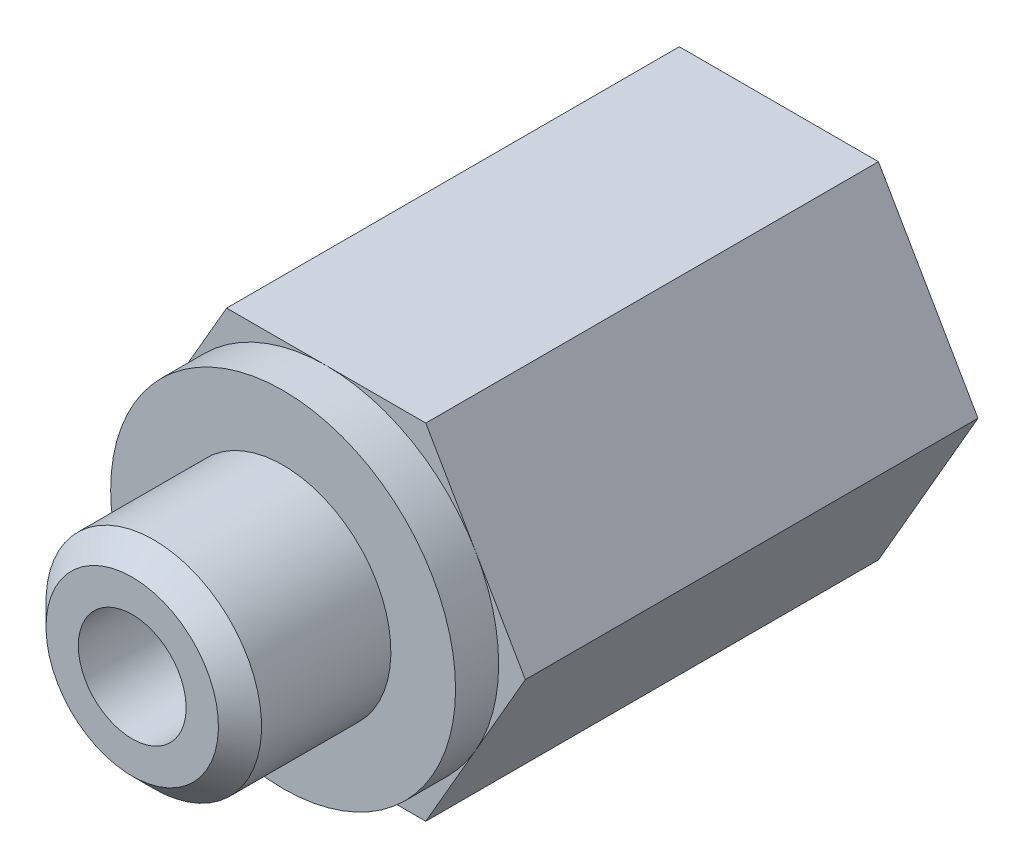
ISO-10303-21;
HEADER;
FILE_DESCRIPTION(('STEP AP214'),'2;1');
FILE_NAME('part.step','',(''),(''),'','','');
FILE_SCHEMA(('AUTOMOTIVE_DESIGN { 1 0 10303 214 1 1 1 1 }'));
ENDSEC;
DATA;
#1=APPLICATION_CONTEXT('core data for automotive mechanical design processes');
#2=APPLICATION_PROTOCOL_DEFINITION('international standard','automotive_design',2000,#1);
#3=PRODUCT_CONTEXT('',#1,'mechanical');
#4=PRODUCT('Part','Part','',(#3));
#5=PRODUCT_RELATED_PRODUCT_CATEGORY('part','',(#4));
#6=PRODUCT_DEFINITION_FORMATION('','',#4);
#7=PRODUCT_DEFINITION_CONTEXT('part definition',#1,'design');
#8=PRODUCT_DEFINITION('design','',#6,#7);
#9=PRODUCT_DEFINITION_SHAPE('','',#8);
#10=(LENGTH_UNIT() NAMED_UNIT(*) SI_UNIT(.MILLI.,.METRE.));
#11=(NAMED_UNIT(*) PLANE_ANGLE_UNIT() SI_UNIT($,.RADIAN.));
#12=(NAMED_UNIT(*) SI_UNIT($,.STERADIAN.) SOLID_ANGLE_UNIT());
#13=UNCERTAINTY_MEASURE_WITH_UNIT(LENGTH_MEASURE(1.E-05),#10,'distance_accuracy_value','');
#14=(GEOMETRIC_REPRESENTATION_CONTEXT(3) GLOBAL_UNCERTAINTY_ASSIGNED_CONTEXT((#13)) GLOBAL_UNIT_ASSIGNED_CONTEXT((#10,
#11,#12)) REPRESENTATION_CONTEXT('',''));
#15=CARTESIAN_POINT('',(0.,0.,0.));
#16=DIRECTION('',(0.,0.,1.));
#17=DIRECTION('',(1.,0.,0.));
#18=AXIS2_PLACEMENT_3D('',#15,#16,#17);
#19=CARTESIAN_POINT('',(0.,4.,6.25));
#20=DIRECTION('',(0.,0.,-1.));
#21=DIRECTION('',(0.,1.,0.));
#22=AXIS2_PLACEMENT_3D('',#19,#20,#21);
#23=PLANE('',#22);
#24=CARTESIAN_POINT('',(0.,0.,6.25));
#25=DIRECTION('',(0.,0.,1.));
#26=DIRECTION('',(0.,-1.,0.));
#27=AXIS2_PLACEMENT_3D('',#24,#25,#26);
#28=CIRCLE('',#27,4.);
#29=CARTESIAN_POINT('',(0.,-4.,6.25));
#30=VERTEX_POINT('',#29);
#31=EDGE_CURVE('E142',#30,#30,#28,.F.);
#32=ORIENTED_EDGE('',*,*,#31,.F.);
#33=EDGE_LOOP('',(#32));
#34=FACE_BOUND('',#33,.T.);
#35=CARTESIAN_POINT('',(0.,0.,6.25));
#36=DIRECTION('',(0.,0.,1.));
#37=DIRECTION('',(0.,-1.,0.));
#38=AXIS2_PLACEMENT_3D('',#35,#36,#37);
#39=CIRCLE('',#38,2.5);
#40=CARTESIAN_POINT('',(0.,-2.5,6.25));
#41=VERTEX_POINT('',#40);
#42=EDGE_CURVE('E19',#41,#41,#39,.T.);
#43=ORIENTED_EDGE('',*,*,#42,.F.);
#44=EDGE_LOOP('',(#43));
#45=FACE_BOUND('',#44,.T.);
#46=ADVANCED_FACE('F16',(#34,#45),#23,.F.);
#47=CARTESIAN_POINT('',(0.,0.,9.75));
#48=DIRECTION('',(0.,0.,1.));
#49=DIRECTION('',(0.,-1.,0.));
#50=AXIS2_PLACEMENT_3D('',#47,#48,#49);
#51=CYLINDRICAL_SURFACE('',#50,2.5);
#52=ORIENTED_EDGE('',*,*,#42,.T.);
#53=EDGE_LOOP('',(#52));
#54=FACE_BOUND('',#53,.T.);
#55=CARTESIAN_POINT('',(0.,0.,9.25000000000864));
#56=DIRECTION('',(0.,0.,-1.));
#57=DIRECTION('',(0.,1.,0.));
#58=AXIS2_PLACEMENT_3D('',#55,#56,#57);
#59=CIRCLE('',#58,2.49999999999773);
#60=CARTESIAN_POINT('',(0.,2.49999999999773,9.25000000000864));
#61=VERTEX_POINT('',#60);
#62=EDGE_CURVE('E105',#61,#61,#59,.F.);
#63=ORIENTED_EDGE('',*,*,#62,.F.);
#64=EDGE_LOOP('',(#63));
#65=FACE_BOUND('',#64,.T.);
#66=ADVANCED_FACE('F163',(#54,#65),#51,.T.);
#67=CARTESIAN_POINT('',(0.,0.,9.75));
#68=DIRECTION('',(0.,0.,1.));
#69=DIRECTION('',(0.,-1.,0.));
#70=AXIS2_PLACEMENT_3D('',#67,#68,#69);
#71=CYLINDRICAL_SURFACE('',#70,4.);
#72=ORIENTED_EDGE('',*,*,#31,.T.);
#73=EDGE_LOOP('',(#72));
#74=FACE_BOUND('',#73,.T.);
#75=CARTESIAN_POINT('',(0.,0.,5.25));
#76=DIRECTION('',(0.,0.,1.));
#77=DIRECTION('',(0.,-1.,0.));
#78=AXIS2_PLACEMENT_3D('',#75,#76,#77);
#79=CIRCLE('',#78,4.);
#80=CARTESIAN_POINT('',(3.46410161513776,-2.,5.25));
#81=VERTEX_POINT('',#80);
#82=CARTESIAN_POINT('',(0.,-4.,5.25));
#83=VERTEX_POINT('',#82);
#84=EDGE_CURVE('E101',#81,#83,#79,.F.);
#85=ORIENTED_EDGE('',*,*,#84,.F.);
#86=CARTESIAN_POINT('',(0.,0.,5.25));
#87=DIRECTION('',(0.,0.,1.));
#88=DIRECTION('',(0.,-1.,0.));
#89=AXIS2_PLACEMENT_3D('',#86,#87,#88);
#90=CIRCLE('',#89,4.);
#91=CARTESIAN_POINT('',(3.46410161513775,2.,5.25));
#92=VERTEX_POINT('',#91);
#93=EDGE_CURVE('E95',#92,#81,#90,.F.);
#94=ORIENTED_EDGE('',*,*,#93,.F.);
#95=CARTESIAN_POINT('',(0.,0.,5.25));
#96=DIRECTION('',(0.,0.,1.));
#97=DIRECTION('',(0.,-1.,0.));
#98=AXIS2_PLACEMENT_3D('',#95,#96,#97);
#99=CIRCLE('',#98,4.);
#100=CARTESIAN_POINT('',(0.,4.,5.25));
#101=VERTEX_POINT('',#100);
#102=EDGE_CURVE('E84',#101,#92,#99,.F.);
#103=ORIENTED_EDGE('',*,*,#102,.F.);
#104=CARTESIAN_POINT('',(0.,0.,5.25));
#105=DIRECTION('',(0.,0.,1.));
#106=DIRECTION('',(0.,-1.,0.));
#107=AXIS2_PLACEMENT_3D('',#104,#105,#106);
#108=CIRCLE('',#107,4.);
#109=CARTESIAN_POINT('',(-3.46410161513775,2.,5.25));
#110=VERTEX_POINT('',#109);
#111=EDGE_CURVE('E94',#110,#101,#108,.F.);
#112=ORIENTED_EDGE('',*,*,#111,.F.);
#113=CARTESIAN_POINT('',(0.,0.,5.25));
#114=DIRECTION('',(0.,0.,1.));
#115=DIRECTION('',(0.,-1.,0.));
#116=AXIS2_PLACEMENT_3D('',#113,#114,#115);
#117=CIRCLE('',#116,4.);
#118=CARTESIAN_POINT('',(-3.46410161513775,-2.,5.25));
#119=VERTEX_POINT('',#118);
#120=EDGE_CURVE('E155',#119,#110,#117,.F.);
#121=ORIENTED_EDGE('',*,*,#120,.F.);
#122=CARTESIAN_POINT('',(0.,0.,5.25));
#123=DIRECTION('',(0.,0.,1.));
#124=DIRECTION('',(0.,-1.,0.));
#125=AXIS2_PLACEMENT_3D('',#122,#123,#124);
#126=CIRCLE('',#125,4.);
#127=EDGE_CURVE('E153',#83,#119,#126,.F.);
#128=ORIENTED_EDGE('',*,*,#127,.F.);
#129=EDGE_LOOP('',(#85,#94,#103,#112,#121,#128));
#130=FACE_BOUND('',#129,.T.);
#131=ADVANCED_FACE('F99',(#74,#130),#71,.T.);
#132=CARTESIAN_POINT('',(0.,0.,9.25000000006548));
#133=DIRECTION('',(0.,0.,-1.));
#134=DIRECTION('',(0.,1.,0.));
#135=AXIS2_PLACEMENT_3D('',#132,#133,#134);
#136=CONICAL_SURFACE('',#135,2.49999999988404,0.785398163397448);
#137=CARTESIAN_POINT('',(0.,0.,9.74999999999682));
#138=DIRECTION('',(0.,0.,-1.));
#139=DIRECTION('',(0.,1.,0.));
#140=AXIS2_PLACEMENT_3D('',#137,#138,#139);
#141=CIRCLE('',#140,1.99999999995271);
#142=CARTESIAN_POINT('',(0.,1.99999999995271,9.74999999999682));
#143=VERTEX_POINT('',#142);
#144=EDGE_CURVE('E149',#143,#143,#141,.T.);
#145=ORIENTED_EDGE('',*,*,#144,.T.);
#146=EDGE_LOOP('',(#145));
#147=FACE_BOUND('',#146,.T.);
#148=ORIENTED_EDGE('',*,*,#62,.T.);
#149=EDGE_LOOP('',(#148));
#150=FACE_BOUND('',#149,.T.);
#151=ADVANCED_FACE('F238',(#147,#150),#136,.T.);
#152=CARTESIAN_POINT('',(2.30940107675851,-4.,5.25));
#153=DIRECTION('',(0.,0.,1.));
#154=DIRECTION('',(1.,0.,0.));
#155=AXIS2_PLACEMENT_3D('',#152,#153,#154);
#156=PLANE('',#155);
#157=DIRECTION('',(-0.499999999999999,-0.866025403784439,0.));
#158=VECTOR('',#157,1.);
#159=CARTESIAN_POINT('',(2.3094010767585,-4.,5.25));
#160=LINE('',#159,#158);
#161=CARTESIAN_POINT('',(4.618802153517,0.,5.25));
#162=VERTEX_POINT('',#161);
#163=EDGE_CURVE('E117',#81,#162,#160,.F.);
#164=ORIENTED_EDGE('',*,*,#163,.T.);
#165=DIRECTION('',(0.5,-0.866025403784439,0.));
#166=VECTOR('',#165,1.);
#167=CARTESIAN_POINT('',(4.618802153517,0.,5.25));
#168=LINE('',#167,#166);
#169=EDGE_CURVE('E111',#162,#92,#168,.F.);
#170=ORIENTED_EDGE('',*,*,#169,.T.);
#171=ORIENTED_EDGE('',*,*,#93,.T.);
#172=EDGE_LOOP('',(#164,#170,#171));
#173=FACE_BOUND('',#172,.T.);
#174=ADVANCED_FACE('F116',(#173),#156,.T.);
#175=CARTESIAN_POINT('',(2.30940107675851,-4.,5.25));
#176=DIRECTION('',(0.,0.,1.));
#177=DIRECTION('',(1.,0.,0.));
#178=AXIS2_PLACEMENT_3D('',#175,#176,#177);
#179=PLANE('',#178);
#180=DIRECTION('',(0.5,-0.866025403784439,0.));
#181=VECTOR('',#180,1.);
#182=CARTESIAN_POINT('',(4.618802153517,0.,5.25));
#183=LINE('',#182,#181);
#184=CARTESIAN_POINT('',(2.3094010767585,4.,5.25));
#185=VERTEX_POINT('',#184);
#186=EDGE_CURVE('E88',#92,#185,#183,.F.);
#187=ORIENTED_EDGE('',*,*,#186,.T.);
#188=DIRECTION('',(1.,0.,0.));
#189=VECTOR('',#188,1.);
#190=CARTESIAN_POINT('',(2.3094010767585,4.,5.25));
#191=LINE('',#190,#189);
#192=EDGE_CURVE('E90',#185,#101,#191,.F.);
#193=ORIENTED_EDGE('',*,*,#192,.T.);
#194=ORIENTED_EDGE('',*,*,#102,.T.);
#195=EDGE_LOOP('',(#187,#193,#194));
#196=FACE_BOUND('',#195,.T.);
#197=ADVANCED_FACE('F86',(#196),#179,.T.);
#198=CARTESIAN_POINT('',(2.30940107675851,-4.,5.25));
#199=DIRECTION('',(0.,0.,1.));
#200=DIRECTION('',(1.,0.,0.));
#201=AXIS2_PLACEMENT_3D('',#198,#199,#200);
#202=PLANE('',#201);
#203=DIRECTION('',(1.,0.,0.));
#204=VECTOR('',#203,1.);
#205=CARTESIAN_POINT('',(2.3094010767585,4.,5.25));
#206=LINE('',#205,#204);
#207=CARTESIAN_POINT('',(-2.30940107675849,4.,5.25));
#208=VERTEX_POINT('',#207);
#209=EDGE_CURVE('E414',#101,#208,#206,.F.);
#210=ORIENTED_EDGE('',*,*,#209,.T.);
#211=DIRECTION('',(0.5,0.866025403784439,0.));
#212=VECTOR('',#211,1.);
#213=CARTESIAN_POINT('',(-2.30940107675849,4.,5.25));
#214=LINE('',#213,#212);
#215=EDGE_CURVE('E416',#208,#110,#214,.F.);
#216=ORIENTED_EDGE('',*,*,#215,.T.);
#217=ORIENTED_EDGE('',*,*,#111,.T.);
#218=EDGE_LOOP('',(#210,#216,#217));
#219=FACE_BOUND('',#218,.T.);
#220=ADVANCED_FACE('F229',(#219),#202,.T.);
#221=CARTESIAN_POINT('',(2.30940107675851,-4.,5.25));
#222=DIRECTION('',(0.,0.,1.));
#223=DIRECTION('',(1.,0.,0.));
#224=AXIS2_PLACEMENT_3D('',#221,#222,#223);
#225=PLANE('',#224);
#226=DIRECTION('',(0.5,0.866025403784439,0.));
#227=VECTOR('',#226,1.);
#228=CARTESIAN_POINT('',(-2.30940107675849,4.,5.25));
#229=LINE('',#228,#227);
#230=CARTESIAN_POINT('',(-4.61880215351699,0.,5.25));
#231=VERTEX_POINT('',#230);
#232=EDGE_CURVE('E424',#110,#231,#229,.F.);
#233=ORIENTED_EDGE('',*,*,#232,.T.);
#234=DIRECTION('',(-0.5,0.866025403784439,0.));
#235=VECTOR('',#234,1.);
#236=CARTESIAN_POINT('',(-4.61880215351699,0.,5.25));
#237=LINE('',#236,#235);
#238=EDGE_CURVE('E474',#231,#119,#237,.F.);
#239=ORIENTED_EDGE('',*,*,#238,.T.);
#240=ORIENTED_EDGE('',*,*,#120,.T.);
#241=EDGE_LOOP('',(#233,#239,#240));
#242=FACE_BOUND('',#241,.T.);
#243=ADVANCED_FACE('F225',(#242),#225,.T.);
#244=CARTESIAN_POINT('',(2.30940107675851,-4.,5.25));
#245=DIRECTION('',(0.,0.,1.));
#246=DIRECTION('',(1.,0.,0.));
#247=AXIS2_PLACEMENT_3D('',#244,#245,#246);
#248=PLANE('',#247);
#249=DIRECTION('',(-0.5,0.866025403784439,0.));
#250=VECTOR('',#249,1.);
#251=CARTESIAN_POINT('',(-4.61880215351699,0.,5.25));
#252=LINE('',#251,#250);
#253=CARTESIAN_POINT('',(-2.30940107675849,-4.,5.25));
#254=VERTEX_POINT('',#253);
#255=EDGE_CURVE('E477',#119,#254,#252,.F.);
#256=ORIENTED_EDGE('',*,*,#255,.T.);
#257=DIRECTION('',(1.,0.,0.));
#258=VECTOR('',#257,1.);
#259=CARTESIAN_POINT('',(-2.30940107675849,-4.,5.25));
#260=LINE('',#259,#258);
#261=EDGE_CURVE('E493',#254,#83,#260,.T.);
#262=ORIENTED_EDGE('',*,*,#261,.T.);
#263=ORIENTED_EDGE('',*,*,#127,.T.);
#264=EDGE_LOOP('',(#256,#262,#263));
#265=FACE_BOUND('',#264,.T.);
#266=ADVANCED_FACE('F221',(#265),#248,.T.);
#267=CARTESIAN_POINT('',(2.30940107675851,-4.,5.25));
#268=DIRECTION('',(0.,0.,1.));
#269=DIRECTION('',(1.,0.,0.));
#270=AXIS2_PLACEMENT_3D('',#267,#268,#269);
#271=PLANE('',#270);
#272=DIRECTION('',(1.,0.,0.));
#273=VECTOR('',#272,1.);
#274=CARTESIAN_POINT('',(-2.30940107675849,-4.,5.25));
#275=LINE('',#274,#273);
#276=CARTESIAN_POINT('',(2.3094010767585,-4.,5.25));
#277=VERTEX_POINT('',#276);
#278=EDGE_CURVE('E457',#83,#277,#275,.T.);
#279=ORIENTED_EDGE('',*,*,#278,.T.);
#280=DIRECTION('',(-0.499999999999999,-0.866025403784439,0.));
#281=VECTOR('',#280,1.);
#282=CARTESIAN_POINT('',(2.3094010767585,-4.,5.25));
#283=LINE('',#282,#281);
#284=EDGE_CURVE('E130',#277,#81,#283,.F.);
#285=ORIENTED_EDGE('',*,*,#284,.T.);
#286=ORIENTED_EDGE('',*,*,#84,.T.);
#287=EDGE_LOOP('',(#279,#285,#286));
#288=FACE_BOUND('',#287,.T.);
#289=ADVANCED_FACE('F217',(#288),#271,.T.);
#290=CARTESIAN_POINT('',(0.,2.,9.75));
#291=DIRECTION('',(0.,0.,-1.));
#292=DIRECTION('',(0.,1.,0.));
#293=AXIS2_PLACEMENT_3D('',#290,#291,#292);
#294=PLANE('',#293);
#295=ORIENTED_EDGE('',*,*,#144,.F.);
#296=EDGE_LOOP('',(#295));
#297=FACE_BOUND('',#296,.T.);
#298=CARTESIAN_POINT('',(0.,0.,9.74999999999999));
#299=DIRECTION('',(0.,0.,-1.));
#300=DIRECTION('',(-1.,0.,0.));
#301=AXIS2_PLACEMENT_3D('',#298,#299,#300);
#302=CIRCLE('',#301,1.25);
#303=CARTESIAN_POINT('',(-1.25,0.,9.74999999999999));
#304=VERTEX_POINT('',#303);
#305=EDGE_CURVE('E137',#304,#304,#302,.T.);
#306=ORIENTED_EDGE('',*,*,#305,.T.);
#307=EDGE_LOOP('',(#306));
#308=FACE_BOUND('',#307,.T.);
#309=ADVANCED_FACE('F213',(#297,#308),#294,.F.);
#310=CARTESIAN_POINT('',(2.3094010767585,-4.,5.25));
#311=DIRECTION('',(-0.866025403784439,0.499999999999999,0.));
#312=DIRECTION('',(-0.499999999999999,-0.866025403784439,0.));
#313=AXIS2_PLACEMENT_3D('',#310,#311,#312);
#314=PLANE('',#313);
#315=DIRECTION('',(0.,0.,1.));
#316=VECTOR('',#315,1.);
#317=CARTESIAN_POINT('',(4.618802153517,0.,5.25));
#318=LINE('',#317,#316);
#319=CARTESIAN_POINT('',(4.618802153517,0.,-5.25));
#320=VERTEX_POINT('',#319);
#321=EDGE_CURVE('E118',#320,#162,#318,.T.);
#322=ORIENTED_EDGE('',*,*,#321,.T.);
#323=ORIENTED_EDGE('',*,*,#163,.F.);
#324=ORIENTED_EDGE('',*,*,#284,.F.);
#325=DIRECTION('',(0.,0.,1.));
#326=VECTOR('',#325,1.);
#327=CARTESIAN_POINT('',(2.3094010767585,-4.,5.25));
#328=LINE('',#327,#326);
#329=CARTESIAN_POINT('',(2.3094010767585,-4.,-5.25));
#330=VERTEX_POINT('',#329);
#331=EDGE_CURVE('E148',#277,#330,#328,.F.);
#332=ORIENTED_EDGE('',*,*,#331,.T.);
#333=DIRECTION('',(0.499999999999998,0.866025403784439,0.));
#334=VECTOR('',#333,1.);
#335=CARTESIAN_POINT('',(2.3094010767585,-4.,-5.25));
#336=LINE('',#335,#334);
#337=EDGE_CURVE('E133',#330,#320,#336,.T.);
#338=ORIENTED_EDGE('',*,*,#337,.T.);
#339=EDGE_LOOP('',(#322,#323,#324,#332,#338));
#340=FACE_BOUND('',#339,.T.);
#341=ADVANCED_FACE('F210',(#340),#314,.F.);
#342=CARTESIAN_POINT('',(4.618802153517,0.,5.25));
#343=DIRECTION('',(-0.866025403784439,-0.5,0.));
#344=DIRECTION('',(0.5,-0.866025403784439,0.));
#345=AXIS2_PLACEMENT_3D('',#342,#343,#344);
#346=PLANE('',#345);
#347=DIRECTION('',(0.,0.,-1.));
#348=VECTOR('',#347,1.);
#349=CARTESIAN_POINT('',(2.3094010767585,4.,5.25));
#350=LINE('',#349,#348);
#351=CARTESIAN_POINT('',(2.3094010767585,4.,-5.25));
#352=VERTEX_POINT('',#351);
#353=EDGE_CURVE('E114',#352,#185,#350,.F.);
#354=ORIENTED_EDGE('',*,*,#353,.T.);
#355=ORIENTED_EDGE('',*,*,#186,.F.);
#356=ORIENTED_EDGE('',*,*,#169,.F.);
#357=ORIENTED_EDGE('',*,*,#321,.F.);
#358=DIRECTION('',(-0.499999999999999,0.866025403784439,0.));
#359=VECTOR('',#358,1.);
#360=CARTESIAN_POINT('',(4.618802153517,0.,-5.25));
#361=LINE('',#360,#359);
#362=EDGE_CURVE('E136',#320,#352,#361,.T.);
#363=ORIENTED_EDGE('',*,*,#362,.T.);
#364=EDGE_LOOP('',(#354,#355,#356,#357,#363));
#365=FACE_BOUND('',#364,.T.);
#366=ADVANCED_FACE('F110',(#365),#346,.F.);
#367=CARTESIAN_POINT('',(2.3094010767585,4.,5.25));
#368=DIRECTION('',(0.,-1.,0.));
#369=DIRECTION('',(0.,0.,-1.));
#370=AXIS2_PLACEMENT_3D('',#367,#368,#369);
#371=PLANE('',#370);
#372=DIRECTION('',(0.,0.,1.));
#373=VECTOR('',#372,1.);
#374=CARTESIAN_POINT('',(-2.30940107675849,4.,5.25));
#375=LINE('',#374,#373);
#376=CARTESIAN_POINT('',(-2.30940107675849,4.,-5.25));
#377=VERTEX_POINT('',#376);
#378=EDGE_CURVE('E418',#377,#208,#375,.T.);
#379=ORIENTED_EDGE('',*,*,#378,.T.);
#380=ORIENTED_EDGE('',*,*,#209,.F.);
#381=ORIENTED_EDGE('',*,*,#192,.F.);
#382=ORIENTED_EDGE('',*,*,#353,.F.);
#383=DIRECTION('',(1.,0.,0.));
#384=VECTOR('',#383,1.);
#385=CARTESIAN_POINT('',(2.30940107675851,4.,-5.25));
#386=LINE('',#385,#384);
#387=EDGE_CURVE('E428',#352,#377,#386,.F.);
#388=ORIENTED_EDGE('',*,*,#387,.T.);
#389=EDGE_LOOP('',(#379,#380,#381,#382,#388));
#390=FACE_BOUND('',#389,.T.);
#391=ADVANCED_FACE('F203',(#390),#371,.F.);
#392=CARTESIAN_POINT('',(-2.30940107675849,4.,5.25));
#393=DIRECTION('',(0.866025403784439,-0.5,0.));
#394=DIRECTION('',(0.5,0.866025403784439,0.));
#395=AXIS2_PLACEMENT_3D('',#392,#393,#394);
#396=PLANE('',#395);
#397=DIRECTION('',(0.,0.,1.));
#398=VECTOR('',#397,1.);
#399=CARTESIAN_POINT('',(-4.61880215351699,0.,5.25));
#400=LINE('',#399,#398);
#401=CARTESIAN_POINT('',(-4.61880215351699,0.,-5.25));
#402=VERTEX_POINT('',#401);
#403=EDGE_CURVE('E478',#402,#231,#400,.T.);
#404=ORIENTED_EDGE('',*,*,#403,.T.);
#405=ORIENTED_EDGE('',*,*,#232,.F.);
#406=ORIENTED_EDGE('',*,*,#215,.F.);
#407=ORIENTED_EDGE('',*,*,#378,.F.);
#408=DIRECTION('',(-0.499999999999999,-0.866025403784439,0.));
#409=VECTOR('',#408,1.);
#410=CARTESIAN_POINT('',(-2.30940107675849,4.,-5.25));
#411=LINE('',#410,#409);
#412=EDGE_CURVE('E438',#377,#402,#411,.T.);
#413=ORIENTED_EDGE('',*,*,#412,.T.);
#414=EDGE_LOOP('',(#404,#405,#406,#407,#413));
#415=FACE_BOUND('',#414,.T.);
#416=ADVANCED_FACE('F199',(#415),#396,.F.);
#417=CARTESIAN_POINT('',(-4.61880215351699,0.,5.25));
#418=DIRECTION('',(0.866025403784439,0.5,0.));
#419=DIRECTION('',(-0.5,0.866025403784439,0.));
#420=AXIS2_PLACEMENT_3D('',#417,#418,#419);
#421=PLANE('',#420);
#422=DIRECTION('',(0.,0.,1.));
#423=VECTOR('',#422,1.);
#424=CARTESIAN_POINT('',(-2.30940107675849,-4.,5.25));
#425=LINE('',#424,#423);
#426=CARTESIAN_POINT('',(-2.30940107675849,-4.,-5.25));
#427=VERTEX_POINT('',#426);
#428=EDGE_CURVE('E34',#427,#254,#425,.T.);
#429=ORIENTED_EDGE('',*,*,#428,.T.);
#430=ORIENTED_EDGE('',*,*,#255,.F.);
#431=ORIENTED_EDGE('',*,*,#238,.F.);
#432=ORIENTED_EDGE('',*,*,#403,.F.);
#433=DIRECTION('',(0.499999999999999,-0.866025403784439,0.));
#434=VECTOR('',#433,1.);
#435=CARTESIAN_POINT('',(-4.61880215351699,0.,-5.25));
#436=LINE('',#435,#434);
#437=EDGE_CURVE('E461',#402,#427,#436,.T.);
#438=ORIENTED_EDGE('',*,*,#437,.T.);
#439=EDGE_LOOP('',(#429,#430,#431,#432,#438));
#440=FACE_BOUND('',#439,.T.);
#441=ADVANCED_FACE('F196',(#440),#421,.F.);
#442=CARTESIAN_POINT('',(-2.30940107675849,-4.,5.25));
#443=DIRECTION('',(0.,1.,0.));
#444=DIRECTION('',(0.,0.,1.));
#445=AXIS2_PLACEMENT_3D('',#442,#443,#444);
#446=PLANE('',#445);
#447=ORIENTED_EDGE('',*,*,#331,.F.);
#448=ORIENTED_EDGE('',*,*,#278,.F.);
#449=ORIENTED_EDGE('',*,*,#261,.F.);
#450=ORIENTED_EDGE('',*,*,#428,.F.);
#451=DIRECTION('',(1.,0.,0.));
#452=VECTOR('',#451,1.);
#453=CARTESIAN_POINT('',(2.30940107675851,-4.,-5.25));
#454=LINE('',#453,#452);
#455=EDGE_CURVE('E459',#427,#330,#454,.T.);
#456=ORIENTED_EDGE('',*,*,#455,.T.);
#457=EDGE_LOOP('',(#447,#448,#449,#450,#456));
#458=FACE_BOUND('',#457,.T.);
#459=ADVANCED_FACE('F192',(#458),#446,.F.);
#460=CARTESIAN_POINT('',(0.,0.,9.74999999999999));
#461=DIRECTION('',(0.,0.,-1.));
#462=DIRECTION('',(-1.,0.,0.));
#463=AXIS2_PLACEMENT_3D('',#460,#461,#462);
#464=CYLINDRICAL_SURFACE('',#463,1.25);
#465=CARTESIAN_POINT('',(0.,0.,7.76073152616163));
#466=DIRECTION('',(0.,0.,-1.));
#467=DIRECTION('',(-1.,0.,0.));
#468=AXIS2_PLACEMENT_3D('',#465,#466,#467);
#469=CIRCLE('',#468,1.24999999997044);
#470=CARTESIAN_POINT('',(-1.24999999997044,0.,7.76073152616163));
#471=VERTEX_POINT('',#470);
#472=EDGE_CURVE('E145',#471,#471,#469,.T.);
#473=ORIENTED_EDGE('',*,*,#472,.T.);
#474=EDGE_LOOP('',(#473));
#475=FACE_BOUND('',#474,.T.);
#476=ORIENTED_EDGE('',*,*,#305,.F.);
#477=EDGE_LOOP('',(#476));
#478=FACE_BOUND('',#477,.T.);
#479=ADVANCED_FACE('F188',(#475,#478),#464,.F.);
#480=CARTESIAN_POINT('',(2.30940107675851,-4.,-5.25));
#481=DIRECTION('',(0.,0.,1.));
#482=DIRECTION('',(1.,0.,0.));
#483=AXIS2_PLACEMENT_3D('',#480,#481,#482);
#484=PLANE('',#483);
#485=ORIENTED_EDGE('',*,*,#437,.F.);
#486=ORIENTED_EDGE('',*,*,#412,.F.);
#487=ORIENTED_EDGE('',*,*,#387,.F.);
#488=ORIENTED_EDGE('',*,*,#362,.F.);
#489=ORIENTED_EDGE('',*,*,#337,.F.);
#490=ORIENTED_EDGE('',*,*,#455,.F.);
#491=EDGE_LOOP('',(#485,#486,#487,#488,#489,#490));
#492=FACE_BOUND('',#491,.T.);
#493=CARTESIAN_POINT('',(0.,0.,-5.25));
#494=DIRECTION('',(0.,0.,-1.));
#495=DIRECTION('',(-1.,0.,0.));
#496=AXIS2_PLACEMENT_3D('',#493,#494,#495);
#497=CIRCLE('',#496,2.09999999999999);
#498=CARTESIAN_POINT('',(-2.09999999999999,0.,-5.25));
#499=VERTEX_POINT('',#498);
#500=EDGE_CURVE('E25',#499,#499,#497,.F.);
#501=ORIENTED_EDGE('',*,*,#500,.T.);
#502=EDGE_LOOP('',(#501));
#503=FACE_BOUND('',#502,.T.);
#504=ADVANCED_FACE('F180',(#492,#503),#484,.F.);
#505=CARTESIAN_POINT('',(0.,0.,7.24999999994225));
#506=DIRECTION('',(0.,0.,-1.));
#507=DIRECTION('',(-1.,0.,0.));
#508=AXIS2_PLACEMENT_3D('',#505,#506,#507);
#509=CONICAL_SURFACE('',#508,2.09999999998445,1.02974425865411);
#510=ORIENTED_EDGE('',*,*,#472,.F.);
#511=EDGE_LOOP('',(#510));
#512=FACE_BOUND('',#511,.T.);
#513=CARTESIAN_POINT('',(0.,0.,7.25));
#514=DIRECTION('',(0.,0.,-1.));
#515=DIRECTION('',(-1.,0.,0.));
#516=AXIS2_PLACEMENT_3D('',#513,#514,#515);
#517=CIRCLE('',#516,2.09999999999999);
#518=CARTESIAN_POINT('',(-2.09999999999999,0.,7.25));
#519=VERTEX_POINT('',#518);
#520=EDGE_CURVE('E11',#519,#519,#517,.T.);
#521=ORIENTED_EDGE('',*,*,#520,.T.);
#522=EDGE_LOOP('',(#521));
#523=FACE_BOUND('',#522,.T.);
#524=ADVANCED_FACE('F174',(#512,#523),#509,.F.);
#525=CARTESIAN_POINT('',(0.,0.,-5.25));
#526=DIRECTION('',(0.,0.,-1.));
#527=DIRECTION('',(-1.,0.,0.));
#528=AXIS2_PLACEMENT_3D('',#525,#526,#527);
#529=CYLINDRICAL_SURFACE('',#528,2.09999999999999);
#530=ORIENTED_EDGE('',*,*,#500,.F.);
#531=EDGE_LOOP('',(#530));
#532=FACE_BOUND('',#531,.T.);
#533=ORIENTED_EDGE('',*,*,#520,.F.);
#534=EDGE_LOOP('',(#533));
#535=FACE_BOUND('',#534,.T.);
#536=ADVANCED_FACE('F172',(#532,#535),#529,.F.);
#537=CLOSED_SHELL('',(#46,#66,#131,#151,#174,#197,#220,#243,#266,#289,#309,#341,#366,#391,#416,
#441,#459,#479,#504,#524,#536));
#538=MANIFOLD_SOLID_BREP('B1',#537);
#539=ADVANCED_BREP_SHAPE_REPRESENTATION('',(#18,#538),#14);
#540=SHAPE_DEFINITION_REPRESENTATION(#9,#539);
ENDSEC;
END-ISO-10303-21;
